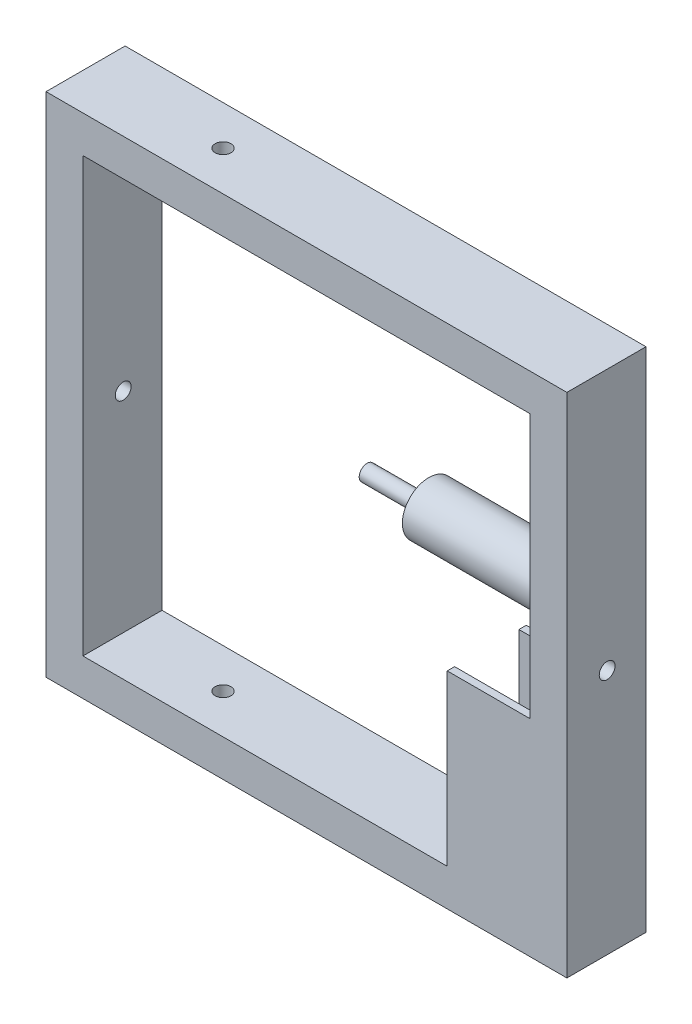
ISO-10303-21;
HEADER;
FILE_DESCRIPTION(('STEP AP214'),'2;1');
FILE_NAME('part.step','',(''),(''),'','','');
FILE_SCHEMA(('AUTOMOTIVE_DESIGN { 1 0 10303 214 1 1 1 1 }'));
ENDSEC;
DATA;
#1=APPLICATION_CONTEXT('core data for automotive mechanical design processes');
#2=APPLICATION_PROTOCOL_DEFINITION('international standard','automotive_design',2000,#1);
#3=PRODUCT_CONTEXT('',#1,'mechanical');
#4=PRODUCT('Part','Part','',(#3));
#5=PRODUCT_RELATED_PRODUCT_CATEGORY('part','',(#4));
#6=PRODUCT_DEFINITION_FORMATION('','',#4);
#7=PRODUCT_DEFINITION_CONTEXT('part definition',#1,'design');
#8=PRODUCT_DEFINITION('design','',#6,#7);
#9=PRODUCT_DEFINITION_SHAPE('','',#8);
#10=(LENGTH_UNIT() NAMED_UNIT(*) SI_UNIT(.MILLI.,.METRE.));
#11=(NAMED_UNIT(*) PLANE_ANGLE_UNIT() SI_UNIT($,.RADIAN.));
#12=(NAMED_UNIT(*) SI_UNIT($,.STERADIAN.) SOLID_ANGLE_UNIT());
#13=UNCERTAINTY_MEASURE_WITH_UNIT(LENGTH_MEASURE(1.E-05),#10,'distance_accuracy_value','');
#14=(GEOMETRIC_REPRESENTATION_CONTEXT(3) GLOBAL_UNCERTAINTY_ASSIGNED_CONTEXT((#13)) GLOBAL_UNIT_ASSIGNED_CONTEXT((#10,
#11,#12)) REPRESENTATION_CONTEXT('',''));
#15=CARTESIAN_POINT('',(0.,0.,0.));
#16=DIRECTION('',(0.,0.,1.));
#17=DIRECTION('',(1.,0.,0.));
#18=AXIS2_PLACEMENT_3D('',#15,#16,#17);
#19=CARTESIAN_POINT('',(76.1000000000001,-85.2151870138584,0.));
#20=DIRECTION('',(0.,-1.,0.));
#21=DIRECTION('',(1.,0.,0.));
#22=AXIS2_PLACEMENT_3D('',#19,#20,#21);
#23=PLANE('',#22);
#24=DIRECTION('',(1.,0.,0.));
#25=VECTOR('',#24,1.);
#26=CARTESIAN_POINT('',(76.1000000000001,-85.2151870138584,13.6));
#27=LINE('',#26,#25);
#28=CARTESIAN_POINT('',(76.1000000000001,-85.2151870138584,13.6));
#29=VERTEX_POINT('',#28);
#30=CARTESIAN_POINT('',(82.8000000000001,-85.2151870138584,13.6));
#31=VERTEX_POINT('',#30);
#32=EDGE_CURVE('E52',#29,#31,#27,.T.);
#33=ORIENTED_EDGE('',*,*,#32,.T.);
#34=DIRECTION('',(0.,0.,-1.));
#35=VECTOR('',#34,1.);
#36=CARTESIAN_POINT('',(82.8000000000001,-85.2151870138584,0.));
#37=LINE('',#36,#35);
#38=CARTESIAN_POINT('',(82.8000000000001,-85.2151870138584,1.4));
#39=VERTEX_POINT('',#38);
#40=EDGE_CURVE('E191',#31,#39,#37,.T.);
#41=ORIENTED_EDGE('',*,*,#40,.T.);
#42=DIRECTION('',(1.,0.,0.));
#43=VECTOR('',#42,1.);
#44=CARTESIAN_POINT('',(76.1000000000001,-85.2151870138584,1.4));
#45=LINE('',#44,#43);
#46=CARTESIAN_POINT('',(76.1000000000001,-85.2151870138584,1.4));
#47=VERTEX_POINT('',#46);
#48=EDGE_CURVE('E189',#47,#39,#45,.T.);
#49=ORIENTED_EDGE('',*,*,#48,.F.);
#50=DIRECTION('',(0.,0.,-1.));
#51=VECTOR('',#50,1.);
#52=CARTESIAN_POINT('',(76.1000000000001,-85.2151870138584,0.));
#53=LINE('',#52,#51);
#54=EDGE_CURVE('E172',#29,#47,#53,.T.);
#55=ORIENTED_EDGE('',*,*,#54,.F.);
#56=EDGE_LOOP('',(#33,#41,#49,#55));
#57=FACE_BOUND('',#56,.T.);
#58=ADVANCED_FACE('F35',(#57),#23,.F.);
#59=CARTESIAN_POINT('',(82.8,-57.1,0.));
#60=DIRECTION('',(0.,1.,0.));
#61=DIRECTION('',(-1.,0.,0.));
#62=AXIS2_PLACEMENT_3D('',#59,#60,#61);
#63=PLANE('',#62);
#64=DIRECTION('',(-1.,0.,0.));
#65=VECTOR('',#64,1.);
#66=CARTESIAN_POINT('',(82.8,-57.1,1.4));
#67=LINE('',#66,#65);
#68=CARTESIAN_POINT('',(91.8,-57.1,1.4));
#69=VERTEX_POINT('',#68);
#70=CARTESIAN_POINT('',(76.1,-57.1,1.4));
#71=VERTEX_POINT('',#70);
#72=EDGE_CURVE('E226',#69,#71,#67,.T.);
#73=ORIENTED_EDGE('',*,*,#72,.F.);
#74=DIRECTION('',(0.,0.,-1.));
#75=VECTOR('',#74,1.);
#76=CARTESIAN_POINT('',(91.8,-57.1,58.));
#77=LINE('',#76,#75);
#78=CARTESIAN_POINT('',(91.8,-57.1,0.));
#79=VERTEX_POINT('',#78);
#80=EDGE_CURVE('E285',#69,#79,#77,.T.);
#81=ORIENTED_EDGE('',*,*,#80,.T.);
#82=DIRECTION('',(1.,0.,0.));
#83=VECTOR('',#82,1.);
#84=CARTESIAN_POINT('',(82.8,-57.1,0.));
#85=LINE('',#84,#83);
#86=CARTESIAN_POINT('',(76.1,-57.1,0.));
#87=VERTEX_POINT('',#86);
#88=EDGE_CURVE('E164',#87,#79,#85,.T.);
#89=ORIENTED_EDGE('',*,*,#88,.F.);
#90=DIRECTION('',(0.,0.,-1.));
#91=VECTOR('',#90,1.);
#92=CARTESIAN_POINT('',(76.1,-57.1,0.));
#93=LINE('',#92,#91);
#94=EDGE_CURVE('E186',#71,#87,#93,.T.);
#95=ORIENTED_EDGE('',*,*,#94,.F.);
#96=EDGE_LOOP('',(#73,#81,#89,#95));
#97=FACE_BOUND('',#96,.T.);
#98=ADVANCED_FACE('F349',(#97),#63,.T.);
#99=CARTESIAN_POINT('',(0.,0.,15.));
#100=DIRECTION('',(0.,0.,1.));
#101=DIRECTION('',(1.,0.,0.));
#102=AXIS2_PLACEMENT_3D('',#99,#100,#101);
#103=PLANE('',#102);
#104=DIRECTION('',(0.,1.,0.));
#105=VECTOR('',#104,1.);
#106=CARTESIAN_POINT('',(76.1000000000001,-85.2151870138584,15.));
#107=LINE('',#106,#105);
#108=CARTESIAN_POINT('',(76.1000000000001,-89.2,15.));
#109=VERTEX_POINT('',#108);
#110=CARTESIAN_POINT('',(76.1,-57.1,15.));
#111=VERTEX_POINT('',#110);
#112=EDGE_CURVE('E155',#109,#111,#107,.T.);
#113=ORIENTED_EDGE('',*,*,#112,.F.);
#114=DIRECTION('',(-1.,0.,0.));
#115=VECTOR('',#114,1.);
#116=CARTESIAN_POINT('',(0.,-89.2,15.));
#117=LINE('',#116,#115);
#118=CARTESIAN_POINT('',(7.,-89.2,15.));
#119=VERTEX_POINT('',#118);
#120=EDGE_CURVE('E240',#109,#119,#117,.T.);
#121=ORIENTED_EDGE('',*,*,#120,.T.);
#122=DIRECTION('',(0.,1.,0.));
#123=VECTOR('',#122,1.);
#124=CARTESIAN_POINT('',(7.,0.,15.));
#125=LINE('',#124,#123);
#126=CARTESIAN_POINT('',(7.,-7.,15.));
#127=VERTEX_POINT('',#126);
#128=EDGE_CURVE('E242',#119,#127,#125,.T.);
#129=ORIENTED_EDGE('',*,*,#128,.T.);
#130=DIRECTION('',(1.,0.,0.));
#131=VECTOR('',#130,1.);
#132=CARTESIAN_POINT('',(0.,-7.,15.));
#133=LINE('',#132,#131);
#134=CARTESIAN_POINT('',(91.8,-7.,15.));
#135=VERTEX_POINT('',#134);
#136=EDGE_CURVE('E237',#127,#135,#133,.T.);
#137=ORIENTED_EDGE('',*,*,#136,.T.);
#138=DIRECTION('',(0.,-1.,0.));
#139=VECTOR('',#138,1.);
#140=CARTESIAN_POINT('',(91.8,0.,15.));
#141=LINE('',#140,#139);
#142=CARTESIAN_POINT('',(91.8,-57.1,15.));
#143=VERTEX_POINT('',#142);
#144=EDGE_CURVE('E159',#135,#143,#141,.T.);
#145=ORIENTED_EDGE('',*,*,#144,.T.);
#146=DIRECTION('',(1.,0.,0.));
#147=VECTOR('',#146,1.);
#148=CARTESIAN_POINT('',(82.8,-57.1,15.));
#149=LINE('',#148,#147);
#150=EDGE_CURVE('E151',#111,#143,#149,.T.);
#151=ORIENTED_EDGE('',*,*,#150,.F.);
#152=EDGE_LOOP('',(#113,#121,#129,#137,#145,#151));
#153=FACE_BOUND('',#152,.T.);
#154=DIRECTION('',(0.,1.,0.));
#155=VECTOR('',#154,1.);
#156=CARTESIAN_POINT('',(98.8,0.,15.));
#157=LINE('',#156,#155);
#158=CARTESIAN_POINT('',(98.8,-96.2,15.));
#159=VERTEX_POINT('',#158);
#160=CARTESIAN_POINT('',(98.8,0.,15.));
#161=VERTEX_POINT('',#160);
#162=EDGE_CURVE('E252',#159,#161,#157,.T.);
#163=ORIENTED_EDGE('',*,*,#162,.T.);
#164=DIRECTION('',(-1.,0.,0.));
#165=VECTOR('',#164,1.);
#166=CARTESIAN_POINT('',(0.,0.,15.));
#167=LINE('',#166,#165);
#168=CARTESIAN_POINT('',(0.,0.,15.));
#169=VERTEX_POINT('',#168);
#170=EDGE_CURVE('E254',#161,#169,#167,.T.);
#171=ORIENTED_EDGE('',*,*,#170,.T.);
#172=DIRECTION('',(0.,-1.,0.));
#173=VECTOR('',#172,1.);
#174=CARTESIAN_POINT('',(0.,0.,15.));
#175=LINE('',#174,#173);
#176=CARTESIAN_POINT('',(0.,-96.2,15.));
#177=VERTEX_POINT('',#176);
#178=EDGE_CURVE('E246',#169,#177,#175,.T.);
#179=ORIENTED_EDGE('',*,*,#178,.T.);
#180=DIRECTION('',(1.,0.,0.));
#181=VECTOR('',#180,1.);
#182=CARTESIAN_POINT('',(0.,-96.2,15.));
#183=LINE('',#182,#181);
#184=EDGE_CURVE('E249',#177,#159,#183,.T.);
#185=ORIENTED_EDGE('',*,*,#184,.T.);
#186=EDGE_LOOP('',(#163,#171,#179,#185));
#187=FACE_BOUND('',#186,.T.);
#188=ADVANCED_FACE('F153',(#153,#187),#103,.T.);
#189=CARTESIAN_POINT('',(0.,0.,0.));
#190=DIRECTION('',(0.,0.,1.));
#191=DIRECTION('',(1.,0.,0.));
#192=AXIS2_PLACEMENT_3D('',#189,#190,#191);
#193=PLANE('',#192);
#194=DIRECTION('',(0.,-1.,0.));
#195=VECTOR('',#194,1.);
#196=CARTESIAN_POINT('',(76.1000000000001,-85.2151870138584,0.));
#197=LINE('',#196,#195);
#198=CARTESIAN_POINT('',(76.1000000000001,-89.2,0.));
#199=VERTEX_POINT('',#198);
#200=EDGE_CURVE('E192',#87,#199,#197,.T.);
#201=ORIENTED_EDGE('',*,*,#200,.F.);
#202=ORIENTED_EDGE('',*,*,#88,.T.);
#203=DIRECTION('',(0.,-1.,0.));
#204=VECTOR('',#203,1.);
#205=CARTESIAN_POINT('',(91.8,0.,0.));
#206=LINE('',#205,#204);
#207=CARTESIAN_POINT('',(91.8,-7.,0.));
#208=VERTEX_POINT('',#207);
#209=EDGE_CURVE('E277',#208,#79,#206,.T.);
#210=ORIENTED_EDGE('',*,*,#209,.F.);
#211=DIRECTION('',(1.,0.,0.));
#212=VECTOR('',#211,1.);
#213=CARTESIAN_POINT('',(0.,-7.,0.));
#214=LINE('',#213,#212);
#215=CARTESIAN_POINT('',(7.,-7.,0.));
#216=VERTEX_POINT('',#215);
#217=EDGE_CURVE('E275',#216,#208,#214,.T.);
#218=ORIENTED_EDGE('',*,*,#217,.F.);
#219=DIRECTION('',(0.,1.,0.));
#220=VECTOR('',#219,1.);
#221=CARTESIAN_POINT('',(7.,0.,0.));
#222=LINE('',#221,#220);
#223=CARTESIAN_POINT('',(7.,-89.2,0.));
#224=VERTEX_POINT('',#223);
#225=EDGE_CURVE('E282',#224,#216,#222,.T.);
#226=ORIENTED_EDGE('',*,*,#225,.F.);
#227=DIRECTION('',(-1.,0.,0.));
#228=VECTOR('',#227,1.);
#229=CARTESIAN_POINT('',(0.,-89.2,0.));
#230=LINE('',#229,#228);
#231=EDGE_CURVE('E280',#199,#224,#230,.T.);
#232=ORIENTED_EDGE('',*,*,#231,.F.);
#233=EDGE_LOOP('',(#201,#202,#210,#218,#226,#232));
#234=FACE_BOUND('',#233,.T.);
#235=DIRECTION('',(-1.,0.,0.));
#236=VECTOR('',#235,1.);
#237=CARTESIAN_POINT('',(0.,0.,0.));
#238=LINE('',#237,#236);
#239=CARTESIAN_POINT('',(98.8,0.,0.));
#240=VERTEX_POINT('',#239);
#241=CARTESIAN_POINT('',(0.,0.,0.));
#242=VERTEX_POINT('',#241);
#243=EDGE_CURVE('E250',#240,#242,#238,.T.);
#244=ORIENTED_EDGE('',*,*,#243,.F.);
#245=DIRECTION('',(0.,1.,0.));
#246=VECTOR('',#245,1.);
#247=CARTESIAN_POINT('',(98.8,0.,0.));
#248=LINE('',#247,#246);
#249=CARTESIAN_POINT('',(98.8,-96.2,0.));
#250=VERTEX_POINT('',#249);
#251=EDGE_CURVE('E261',#250,#240,#248,.T.);
#252=ORIENTED_EDGE('',*,*,#251,.F.);
#253=DIRECTION('',(1.,0.,0.));
#254=VECTOR('',#253,1.);
#255=CARTESIAN_POINT('',(0.,-96.2,0.));
#256=LINE('',#255,#254);
#257=CARTESIAN_POINT('',(0.,-96.2,0.));
#258=VERTEX_POINT('',#257);
#259=EDGE_CURVE('E259',#258,#250,#256,.T.);
#260=ORIENTED_EDGE('',*,*,#259,.F.);
#261=DIRECTION('',(0.,-1.,0.));
#262=VECTOR('',#261,1.);
#263=CARTESIAN_POINT('',(0.,0.,0.));
#264=LINE('',#263,#262);
#265=EDGE_CURVE('E245',#242,#258,#264,.T.);
#266=ORIENTED_EDGE('',*,*,#265,.F.);
#267=EDGE_LOOP('',(#244,#252,#260,#266));
#268=FACE_BOUND('',#267,.T.);
#269=ADVANCED_FACE('F318',(#234,#268),#193,.F.);
#270=CARTESIAN_POINT('',(0.,0.,15.));
#271=DIRECTION('',(1.,0.,0.));
#272=DIRECTION('',(0.,1.,0.));
#273=AXIS2_PLACEMENT_3D('',#270,#271,#272);
#274=PLANE('',#273);
#275=CARTESIAN_POINT('',(0.,-49.5018127111706,7.36560305807643));
#276=DIRECTION('',(1.,0.,0.));
#277=DIRECTION('',(0.,1.,0.));
#278=AXIS2_PLACEMENT_3D('',#275,#276,#277);
#279=CIRCLE('',#278,1.5);
#280=CARTESIAN_POINT('',(0.,-48.0018127111706,7.36560305807643));
#281=VERTEX_POINT('',#280);
#282=EDGE_CURVE('E180',#281,#281,#279,.F.);
#283=ORIENTED_EDGE('',*,*,#282,.F.);
#284=EDGE_LOOP('',(#283));
#285=FACE_BOUND('',#284,.T.);
#286=ORIENTED_EDGE('',*,*,#265,.T.);
#287=DIRECTION('',(0.,0.,-1.));
#288=VECTOR('',#287,1.);
#289=CARTESIAN_POINT('',(0.,-96.2,15.));
#290=LINE('',#289,#288);
#291=EDGE_CURVE('E272',#177,#258,#290,.T.);
#292=ORIENTED_EDGE('',*,*,#291,.F.);
#293=ORIENTED_EDGE('',*,*,#178,.F.);
#294=DIRECTION('',(0.,0.,-1.));
#295=VECTOR('',#294,1.);
#296=CARTESIAN_POINT('',(0.,0.,15.));
#297=LINE('',#296,#295);
#298=EDGE_CURVE('E256',#169,#242,#297,.T.);
#299=ORIENTED_EDGE('',*,*,#298,.T.);
#300=EDGE_LOOP('',(#286,#292,#293,#299));
#301=FACE_BOUND('',#300,.T.);
#302=ADVANCED_FACE('F314',(#285,#301),#274,.F.);
#303=CARTESIAN_POINT('',(0.,-96.2,15.));
#304=DIRECTION('',(0.,1.,0.));
#305=DIRECTION('',(0.,0.,1.));
#306=AXIS2_PLACEMENT_3D('',#303,#304,#305);
#307=PLANE('',#306);
#308=CARTESIAN_POINT('',(26.080914383698,-96.2,7.5));
#309=DIRECTION('',(0.,1.,0.));
#310=DIRECTION('',(0.,0.,1.));
#311=AXIS2_PLACEMENT_3D('',#308,#309,#310);
#312=CIRCLE('',#311,1.5);
#313=CARTESIAN_POINT('',(26.080914383698,-96.2,9.));
#314=VERTEX_POINT('',#313);
#315=EDGE_CURVE('E292',#314,#314,#312,.F.);
#316=ORIENTED_EDGE('',*,*,#315,.F.);
#317=EDGE_LOOP('',(#316));
#318=FACE_BOUND('',#317,.T.);
#319=ORIENTED_EDGE('',*,*,#259,.T.);
#320=DIRECTION('',(0.,0.,-1.));
#321=VECTOR('',#320,1.);
#322=CARTESIAN_POINT('',(98.8,-96.2,15.));
#323=LINE('',#322,#321);
#324=EDGE_CURVE('E269',#159,#250,#323,.T.);
#325=ORIENTED_EDGE('',*,*,#324,.F.);
#326=ORIENTED_EDGE('',*,*,#184,.F.);
#327=ORIENTED_EDGE('',*,*,#291,.T.);
#328=EDGE_LOOP('',(#319,#325,#326,#327));
#329=FACE_BOUND('',#328,.T.);
#330=ADVANCED_FACE('F317',(#318,#329),#307,.F.);
#331=CARTESIAN_POINT('',(98.8,0.,15.));
#332=DIRECTION('',(-1.,0.,0.));
#333=DIRECTION('',(0.,-1.,0.));
#334=AXIS2_PLACEMENT_3D('',#331,#332,#333);
#335=PLANE('',#334);
#336=CARTESIAN_POINT('',(98.8,-49.5018127111706,7.36560305807643));
#337=DIRECTION('',(-1.,0.,0.));
#338=DIRECTION('',(0.,-1.,0.));
#339=AXIS2_PLACEMENT_3D('',#336,#337,#338);
#340=CIRCLE('',#339,1.5);
#341=CARTESIAN_POINT('',(98.8,-51.0018127111706,7.36560305807643));
#342=VERTEX_POINT('',#341);
#343=EDGE_CURVE('E296',#342,#342,#340,.F.);
#344=ORIENTED_EDGE('',*,*,#343,.F.);
#345=EDGE_LOOP('',(#344));
#346=FACE_BOUND('',#345,.T.);
#347=DIRECTION('',(0.,0.,-1.));
#348=VECTOR('',#347,1.);
#349=CARTESIAN_POINT('',(98.8,0.,15.));
#350=LINE('',#349,#348);
#351=EDGE_CURVE('E266',#161,#240,#350,.T.);
#352=ORIENTED_EDGE('',*,*,#351,.F.);
#353=ORIENTED_EDGE('',*,*,#162,.F.);
#354=ORIENTED_EDGE('',*,*,#324,.T.);
#355=ORIENTED_EDGE('',*,*,#251,.T.);
#356=EDGE_LOOP('',(#352,#353,#354,#355));
#357=FACE_BOUND('',#356,.T.);
#358=ADVANCED_FACE('F334',(#346,#357),#335,.F.);
#359=CARTESIAN_POINT('',(0.,0.,15.));
#360=DIRECTION('',(0.,-1.,0.));
#361=DIRECTION('',(0.,0.,-1.));
#362=AXIS2_PLACEMENT_3D('',#359,#360,#361);
#363=PLANE('',#362);
#364=CARTESIAN_POINT('',(26.080914383698,0.,7.5));
#365=DIRECTION('',(0.,-1.,0.));
#366=DIRECTION('',(0.,0.,-1.));
#367=AXIS2_PLACEMENT_3D('',#364,#365,#366);
#368=CIRCLE('',#367,1.5);
#369=CARTESIAN_POINT('',(26.080914383698,0.,6.));
#370=VERTEX_POINT('',#369);
#371=EDGE_CURVE('E299',#370,#370,#368,.F.);
#372=ORIENTED_EDGE('',*,*,#371,.F.);
#373=EDGE_LOOP('',(#372));
#374=FACE_BOUND('',#373,.T.);
#375=ORIENTED_EDGE('',*,*,#243,.T.);
#376=ORIENTED_EDGE('',*,*,#298,.F.);
#377=ORIENTED_EDGE('',*,*,#170,.F.);
#378=ORIENTED_EDGE('',*,*,#351,.T.);
#379=EDGE_LOOP('',(#375,#376,#377,#378));
#380=FACE_BOUND('',#379,.T.);
#381=ADVANCED_FACE('F332',(#374,#380),#363,.F.);
#382=CARTESIAN_POINT('',(7.,-7.,58.));
#383=DIRECTION('',(1.,0.,0.));
#384=DIRECTION('',(0.,0.,-1.));
#385=AXIS2_PLACEMENT_3D('',#382,#383,#384);
#386=PLANE('',#385);
#387=CARTESIAN_POINT('',(7.00000000000001,-49.5018127111706,7.36560305807643));
#388=DIRECTION('',(1.,0.,0.));
#389=DIRECTION('',(0.,0.,-1.));
#390=AXIS2_PLACEMENT_3D('',#387,#388,#389);
#391=CIRCLE('',#390,1.5);
#392=CARTESIAN_POINT('',(7.00000000000001,-49.5018127111706,5.86560305807643));
#393=VERTEX_POINT('',#392);
#394=EDGE_CURVE('E291',#393,#393,#391,.F.);
#395=ORIENTED_EDGE('',*,*,#394,.T.);
#396=EDGE_LOOP('',(#395));
#397=FACE_BOUND('',#396,.T.);
#398=DIRECTION('',(0.,0.,-1.));
#399=VECTOR('',#398,1.);
#400=CARTESIAN_POINT('',(7.,-89.2,58.));
#401=LINE('',#400,#399);
#402=EDGE_CURVE('E234',#119,#224,#401,.T.);
#403=ORIENTED_EDGE('',*,*,#402,.T.);
#404=ORIENTED_EDGE('',*,*,#225,.T.);
#405=DIRECTION('',(0.,0.,-1.));
#406=VECTOR('',#405,1.);
#407=CARTESIAN_POINT('',(7.,-7.,58.));
#408=LINE('',#407,#406);
#409=EDGE_CURVE('E163',#127,#216,#408,.T.);
#410=ORIENTED_EDGE('',*,*,#409,.F.);
#411=ORIENTED_EDGE('',*,*,#128,.F.);
#412=EDGE_LOOP('',(#403,#404,#410,#411));
#413=FACE_BOUND('',#412,.T.);
#414=ADVANCED_FACE('F342',(#397,#413),#386,.T.);
#415=CARTESIAN_POINT('',(7.,-89.2,58.));
#416=DIRECTION('',(0.,1.,0.));
#417=DIRECTION('',(-1.,0.,0.));
#418=AXIS2_PLACEMENT_3D('',#415,#416,#417);
#419=PLANE('',#418);
#420=CARTESIAN_POINT('',(26.080914383698,-89.2,7.5));
#421=DIRECTION('',(0.,1.,0.));
#422=DIRECTION('',(-1.,0.,0.));
#423=AXIS2_PLACEMENT_3D('',#420,#421,#422);
#424=CIRCLE('',#423,1.5);
#425=CARTESIAN_POINT('',(24.580914383698,-89.2,7.5));
#426=VERTEX_POINT('',#425);
#427=EDGE_CURVE('E304',#426,#426,#424,.F.);
#428=ORIENTED_EDGE('',*,*,#427,.T.);
#429=EDGE_LOOP('',(#428));
#430=FACE_BOUND('',#429,.T.);
#431=DIRECTION('',(0.,0.,1.));
#432=VECTOR('',#431,1.);
#433=CARTESIAN_POINT('',(76.1000000000001,-89.2,0.));
#434=LINE('',#433,#432);
#435=EDGE_CURVE('E171',#199,#109,#434,.T.);
#436=ORIENTED_EDGE('',*,*,#435,.F.);
#437=ORIENTED_EDGE('',*,*,#231,.T.);
#438=ORIENTED_EDGE('',*,*,#402,.F.);
#439=ORIENTED_EDGE('',*,*,#120,.F.);
#440=EDGE_LOOP('',(#436,#437,#438,#439));
#441=FACE_BOUND('',#440,.T.);
#442=ADVANCED_FACE('F394',(#430,#441),#419,.T.);
#443=CARTESIAN_POINT('',(91.8,-7.,58.));
#444=DIRECTION('',(-1.,0.,0.));
#445=DIRECTION('',(0.,0.,1.));
#446=AXIS2_PLACEMENT_3D('',#443,#444,#445);
#447=PLANE('',#446);
#448=CARTESIAN_POINT('',(91.8,-49.5018127111706,7.36560305807643));
#449=DIRECTION('',(-1.,0.,0.));
#450=DIRECTION('',(0.,0.,1.));
#451=AXIS2_PLACEMENT_3D('',#448,#449,#450);
#452=CIRCLE('',#451,1.5);
#453=CARTESIAN_POINT('',(91.8,-49.5018127111706,8.86560305807643));
#454=VERTEX_POINT('',#453);
#455=EDGE_CURVE('E289',#454,#454,#452,.F.);
#456=ORIENTED_EDGE('',*,*,#455,.T.);
#457=EDGE_LOOP('',(#456));
#458=FACE_BOUND('',#457,.T.);
#459=CARTESIAN_POINT('',(91.8,-39.6,7.49999999999999));
#460=DIRECTION('',(-1.,0.,0.));
#461=DIRECTION('',(0.,0.,1.));
#462=AXIS2_PLACEMENT_3D('',#459,#460,#461);
#463=CIRCLE('',#462,5.01151916714093);
#464=CARTESIAN_POINT('',(91.8,-39.6,12.5115191671409));
#465=VERTEX_POINT('',#464);
#466=EDGE_CURVE('E201',#465,#465,#463,.T.);
#467=ORIENTED_EDGE('',*,*,#466,.F.);
#468=EDGE_LOOP('',(#467));
#469=FACE_BOUND('',#468,.T.);
#470=ORIENTED_EDGE('',*,*,#80,.F.);
#471=DIRECTION('',(0.,-1.,0.));
#472=VECTOR('',#471,1.);
#473=CARTESIAN_POINT('',(91.8,-57.,1.4));
#474=LINE('',#473,#472);
#475=CARTESIAN_POINT('',(91.8,-85.2,1.4));
#476=VERTEX_POINT('',#475);
#477=EDGE_CURVE('E210',#69,#476,#474,.T.);
#478=ORIENTED_EDGE('',*,*,#477,.T.);
#479=DIRECTION('',(0.,0.,1.));
#480=VECTOR('',#479,1.);
#481=CARTESIAN_POINT('',(91.8,-85.2,1.4));
#482=LINE('',#481,#480);
#483=CARTESIAN_POINT('',(91.8,-85.2,13.6));
#484=VERTEX_POINT('',#483);
#485=EDGE_CURVE('E214',#476,#484,#482,.T.);
#486=ORIENTED_EDGE('',*,*,#485,.T.);
#487=DIRECTION('',(0.,1.,0.));
#488=VECTOR('',#487,1.);
#489=CARTESIAN_POINT('',(91.8,-57.,13.6));
#490=LINE('',#489,#488);
#491=CARTESIAN_POINT('',(91.8,-57.1,13.6));
#492=VERTEX_POINT('',#491);
#493=EDGE_CURVE('E217',#484,#492,#490,.T.);
#494=ORIENTED_EDGE('',*,*,#493,.T.);
#495=EDGE_CURVE('E206',#143,#492,#77,.T.);
#496=ORIENTED_EDGE('',*,*,#495,.F.);
#497=ORIENTED_EDGE('',*,*,#144,.F.);
#498=DIRECTION('',(0.,0.,-1.));
#499=VECTOR('',#498,1.);
#500=CARTESIAN_POINT('',(91.8,-7.,58.));
#501=LINE('',#500,#499);
#502=EDGE_CURVE('E231',#135,#208,#501,.T.);
#503=ORIENTED_EDGE('',*,*,#502,.T.);
#504=ORIENTED_EDGE('',*,*,#209,.T.);
#505=EDGE_LOOP('',(#470,#478,#486,#494,#496,#497,#503,#504));
#506=FACE_BOUND('',#505,.T.);
#507=ADVANCED_FACE('F390',(#458,#469,#506),#447,.T.);
#508=CARTESIAN_POINT('',(7.,-7.,58.));
#509=DIRECTION('',(0.,-1.,0.));
#510=DIRECTION('',(1.,0.,0.));
#511=AXIS2_PLACEMENT_3D('',#508,#509,#510);
#512=PLANE('',#511);
#513=CARTESIAN_POINT('',(26.080914383698,-7.,7.5));
#514=DIRECTION('',(0.,-1.,0.));
#515=DIRECTION('',(1.,0.,0.));
#516=AXIS2_PLACEMENT_3D('',#513,#514,#515);
#517=CIRCLE('',#516,1.5);
#518=CARTESIAN_POINT('',(27.580914383698,-7.,7.5));
#519=VERTEX_POINT('',#518);
#520=EDGE_CURVE('E39',#519,#519,#517,.F.);
#521=ORIENTED_EDGE('',*,*,#520,.T.);
#522=EDGE_LOOP('',(#521));
#523=FACE_BOUND('',#522,.T.);
#524=ORIENTED_EDGE('',*,*,#409,.T.);
#525=ORIENTED_EDGE('',*,*,#217,.T.);
#526=ORIENTED_EDGE('',*,*,#502,.F.);
#527=ORIENTED_EDGE('',*,*,#136,.F.);
#528=EDGE_LOOP('',(#524,#525,#526,#527));
#529=FACE_BOUND('',#528,.T.);
#530=ADVANCED_FACE('F387',(#523,#529),#512,.T.);
#531=DIRECTION('',(1.,0.,0.));
#532=VECTOR('',#531,1.);
#533=CARTESIAN_POINT('',(82.8,-57.1,13.6));
#534=LINE('',#533,#532);
#535=CARTESIAN_POINT('',(76.1,-57.1,13.6));
#536=VERTEX_POINT('',#535);
#537=EDGE_CURVE('E175',#536,#492,#534,.T.);
#538=ORIENTED_EDGE('',*,*,#537,.F.);
#539=DIRECTION('',(0.,0.,-1.));
#540=VECTOR('',#539,1.);
#541=CARTESIAN_POINT('',(76.1,-57.1,13.6));
#542=LINE('',#541,#540);
#543=EDGE_CURVE('E169',#111,#536,#542,.T.);
#544=ORIENTED_EDGE('',*,*,#543,.F.);
#545=ORIENTED_EDGE('',*,*,#150,.T.);
#546=ORIENTED_EDGE('',*,*,#495,.T.);
#547=EDGE_LOOP('',(#538,#544,#545,#546));
#548=FACE_BOUND('',#547,.T.);
#549=ADVANCED_FACE('F174',(#548),#63,.T.);
#550=CARTESIAN_POINT('',(91.8,-57.,1.4));
#551=DIRECTION('',(0.,0.,-1.));
#552=DIRECTION('',(0.,1.,0.));
#553=AXIS2_PLACEMENT_3D('',#550,#551,#552);
#554=PLANE('',#553);
#555=ORIENTED_EDGE('',*,*,#72,.T.);
#556=DIRECTION('',(0.,1.,0.));
#557=VECTOR('',#556,1.);
#558=CARTESIAN_POINT('',(76.1,-57.1,1.4));
#559=LINE('',#558,#557);
#560=EDGE_CURVE('E178',#47,#71,#559,.T.);
#561=ORIENTED_EDGE('',*,*,#560,.F.);
#562=ORIENTED_EDGE('',*,*,#48,.T.);
#563=CARTESIAN_POINT('',(83.350917082489,-95.2,1.4));
#564=DIRECTION('',(0.,0.,-1.));
#565=DIRECTION('',(0.,1.,0.));
#566=AXIS2_PLACEMENT_3D('',#563,#564,#565);
#567=CIRCLE('',#566,10.);
#568=CARTESIAN_POINT('',(83.350917082489,-85.2,1.4));
#569=VERTEX_POINT('',#568);
#570=EDGE_CURVE('E11',#39,#569,#567,.T.);
#571=ORIENTED_EDGE('',*,*,#570,.T.);
#572=DIRECTION('',(-1.,0.,0.));
#573=VECTOR('',#572,1.);
#574=CARTESIAN_POINT('',(91.8,-85.2,1.4));
#575=LINE('',#574,#573);
#576=EDGE_CURVE('E220',#476,#569,#575,.T.);
#577=ORIENTED_EDGE('',*,*,#576,.F.);
#578=ORIENTED_EDGE('',*,*,#477,.F.);
#579=EDGE_LOOP('',(#555,#561,#562,#571,#577,#578));
#580=FACE_BOUND('',#579,.T.);
#581=ADVANCED_FACE('F380',(#580),#554,.F.);
#582=CARTESIAN_POINT('',(91.8,-57.,13.6));
#583=DIRECTION('',(0.,0.,1.));
#584=DIRECTION('',(0.,-1.,0.));
#585=AXIS2_PLACEMENT_3D('',#582,#583,#584);
#586=PLANE('',#585);
#587=ORIENTED_EDGE('',*,*,#537,.T.);
#588=ORIENTED_EDGE('',*,*,#493,.F.);
#589=DIRECTION('',(-1.,0.,0.));
#590=VECTOR('',#589,1.);
#591=CARTESIAN_POINT('',(91.8,-85.2,13.6));
#592=LINE('',#591,#590);
#593=CARTESIAN_POINT('',(83.350917082489,-85.2,13.6));
#594=VERTEX_POINT('',#593);
#595=EDGE_CURVE('E221',#484,#594,#592,.T.);
#596=ORIENTED_EDGE('',*,*,#595,.T.);
#597=CARTESIAN_POINT('',(83.350917082489,-95.2,13.6));
#598=DIRECTION('',(0.,0.,1.));
#599=DIRECTION('',(0.,-1.,0.));
#600=AXIS2_PLACEMENT_3D('',#597,#598,#599);
#601=CIRCLE('',#600,10.);
#602=EDGE_CURVE('E44',#594,#31,#601,.T.);
#603=ORIENTED_EDGE('',*,*,#602,.T.);
#604=ORIENTED_EDGE('',*,*,#32,.F.);
#605=DIRECTION('',(0.,-1.,0.));
#606=VECTOR('',#605,1.);
#607=CARTESIAN_POINT('',(76.1,-57.1,13.6));
#608=LINE('',#607,#606);
#609=EDGE_CURVE('E176',#536,#29,#608,.T.);
#610=ORIENTED_EDGE('',*,*,#609,.F.);
#611=EDGE_LOOP('',(#587,#588,#596,#603,#604,#610));
#612=FACE_BOUND('',#611,.T.);
#613=ADVANCED_FACE('F377',(#612),#586,.F.);
#614=CARTESIAN_POINT('',(91.8,-85.2,1.4));
#615=DIRECTION('',(0.,-1.,0.));
#616=DIRECTION('',(1.,0.,0.));
#617=AXIS2_PLACEMENT_3D('',#614,#615,#616);
#618=PLANE('',#617);
#619=ORIENTED_EDGE('',*,*,#576,.T.);
#620=DIRECTION('',(0.,0.,1.));
#621=VECTOR('',#620,1.);
#622=CARTESIAN_POINT('',(83.350917082489,-85.2,1.4));
#623=LINE('',#622,#621);
#624=EDGE_CURVE('E205',#569,#594,#623,.T.);
#625=ORIENTED_EDGE('',*,*,#624,.T.);
#626=ORIENTED_EDGE('',*,*,#595,.F.);
#627=ORIENTED_EDGE('',*,*,#485,.F.);
#628=EDGE_LOOP('',(#619,#625,#626,#627));
#629=FACE_BOUND('',#628,.T.);
#630=ADVANCED_FACE('F375',(#629),#618,.F.);
#631=CARTESIAN_POINT('',(65.1,-39.6,7.49999999999999));
#632=DIRECTION('',(1.,0.,0.));
#633=DIRECTION('',(0.,0.,-1.));
#634=AXIS2_PLACEMENT_3D('',#631,#632,#633);
#635=CYLINDRICAL_SURFACE('',#634,5.01151916714093);
#636=CARTESIAN_POINT('',(65.1,-39.6,7.49999999999999));
#637=DIRECTION('',(-1.,0.,0.));
#638=DIRECTION('',(0.,0.,1.));
#639=AXIS2_PLACEMENT_3D('',#636,#637,#638);
#640=CIRCLE('',#639,5.01151916714093);
#641=CARTESIAN_POINT('',(65.1,-39.6,12.5115191671409));
#642=VERTEX_POINT('',#641);
#643=EDGE_CURVE('E207',#642,#642,#640,.T.);
#644=ORIENTED_EDGE('',*,*,#643,.F.);
#645=EDGE_LOOP('',(#644));
#646=FACE_BOUND('',#645,.T.);
#647=ORIENTED_EDGE('',*,*,#466,.T.);
#648=EDGE_LOOP('',(#647));
#649=FACE_BOUND('',#648,.T.);
#650=ADVANCED_FACE('F371',(#646,#649),#635,.T.);
#651=CARTESIAN_POINT('',(65.1,-39.6,7.49999999999999));
#652=DIRECTION('',(-1.,0.,0.));
#653=DIRECTION('',(0.,0.,1.));
#654=AXIS2_PLACEMENT_3D('',#651,#652,#653);
#655=PLANE('',#654);
#656=CARTESIAN_POINT('',(65.1,-39.6,7.49999999999999));
#657=DIRECTION('',(-1.,0.,0.));
#658=DIRECTION('',(0.,0.,1.));
#659=AXIS2_PLACEMENT_3D('',#656,#657,#658);
#660=CIRCLE('',#659,1.5);
#661=CARTESIAN_POINT('',(65.1,-39.6,8.99999999999999));
#662=VERTEX_POINT('',#661);
#663=EDGE_CURVE('E202',#662,#662,#660,.T.);
#664=ORIENTED_EDGE('',*,*,#663,.F.);
#665=EDGE_LOOP('',(#664));
#666=FACE_BOUND('',#665,.T.);
#667=ORIENTED_EDGE('',*,*,#643,.T.);
#668=EDGE_LOOP('',(#667));
#669=FACE_BOUND('',#668,.T.);
#670=ADVANCED_FACE('F367',(#666,#669),#655,.T.);
#671=CARTESIAN_POINT('',(53.4,-39.6,7.49999999999999));
#672=DIRECTION('',(1.,0.,0.));
#673=DIRECTION('',(0.,0.,-1.));
#674=AXIS2_PLACEMENT_3D('',#671,#672,#673);
#675=CYLINDRICAL_SURFACE('',#674,1.5);
#676=CARTESIAN_POINT('',(53.4,-39.6,7.49999999999999));
#677=DIRECTION('',(-1.,0.,0.));
#678=DIRECTION('',(0.,0.,1.));
#679=AXIS2_PLACEMENT_3D('',#676,#677,#678);
#680=CIRCLE('',#679,1.5);
#681=CARTESIAN_POINT('',(53.4,-39.6,8.99999999999999));
#682=VERTEX_POINT('',#681);
#683=EDGE_CURVE('E196',#682,#682,#680,.T.);
#684=ORIENTED_EDGE('',*,*,#683,.F.);
#685=EDGE_LOOP('',(#684));
#686=FACE_BOUND('',#685,.T.);
#687=ORIENTED_EDGE('',*,*,#663,.T.);
#688=EDGE_LOOP('',(#687));
#689=FACE_BOUND('',#688,.T.);
#690=ADVANCED_FACE('F363',(#686,#689),#675,.T.);
#691=CARTESIAN_POINT('',(53.4,-39.6,7.49999999999999));
#692=DIRECTION('',(-1.,0.,0.));
#693=DIRECTION('',(0.,0.,1.));
#694=AXIS2_PLACEMENT_3D('',#691,#692,#693);
#695=PLANE('',#694);
#696=ORIENTED_EDGE('',*,*,#683,.T.);
#697=EDGE_LOOP('',(#696));
#698=FACE_BOUND('',#697,.T.);
#699=ADVANCED_FACE('F360',(#698),#695,.T.);
#700=CARTESIAN_POINT('',(76.1000000000001,0.,0.));
#701=DIRECTION('',(-1.,0.,0.));
#702=DIRECTION('',(0.,0.,1.));
#703=AXIS2_PLACEMENT_3D('',#700,#701,#702);
#704=PLANE('',#703);
#705=ORIENTED_EDGE('',*,*,#200,.T.);
#706=ORIENTED_EDGE('',*,*,#435,.T.);
#707=ORIENTED_EDGE('',*,*,#112,.T.);
#708=ORIENTED_EDGE('',*,*,#543,.T.);
#709=ORIENTED_EDGE('',*,*,#609,.T.);
#710=ORIENTED_EDGE('',*,*,#54,.T.);
#711=ORIENTED_EDGE('',*,*,#560,.T.);
#712=ORIENTED_EDGE('',*,*,#94,.T.);
#713=EDGE_LOOP('',(#705,#706,#707,#708,#709,#710,#711,#712));
#714=FACE_BOUND('',#713,.T.);
#715=ADVANCED_FACE('F168',(#714),#704,.T.);
#716=CARTESIAN_POINT('',(83.350917082489,-95.2,0.));
#717=DIRECTION('',(0.,0.,1.));
#718=DIRECTION('',(1.,0.,0.));
#719=AXIS2_PLACEMENT_3D('',#716,#717,#718);
#720=CYLINDRICAL_SURFACE('',#719,10.);
#721=ORIENTED_EDGE('',*,*,#570,.F.);
#722=ORIENTED_EDGE('',*,*,#40,.F.);
#723=ORIENTED_EDGE('',*,*,#602,.F.);
#724=ORIENTED_EDGE('',*,*,#624,.F.);
#725=EDGE_LOOP('',(#721,#722,#723,#724));
#726=FACE_BOUND('',#725,.T.);
#727=ADVANCED_FACE('F37',(#726),#720,.T.);
#728=CARTESIAN_POINT('',(135.,-49.5018127111706,7.36560305807643));
#729=DIRECTION('',(-1.,0.,0.));
#730=DIRECTION('',(0.,0.,1.));
#731=AXIS2_PLACEMENT_3D('',#728,#729,#730);
#732=CYLINDRICAL_SURFACE('',#731,1.5);
#733=ORIENTED_EDGE('',*,*,#455,.F.);
#734=EDGE_LOOP('',(#733));
#735=FACE_BOUND('',#734,.T.);
#736=ORIENTED_EDGE('',*,*,#343,.T.);
#737=EDGE_LOOP('',(#736));
#738=FACE_BOUND('',#737,.T.);
#739=ADVANCED_FACE('F431',(#735,#738),#732,.F.);
#740=ORIENTED_EDGE('',*,*,#394,.F.);
#741=EDGE_LOOP('',(#740));
#742=FACE_BOUND('',#741,.T.);
#743=ORIENTED_EDGE('',*,*,#282,.T.);
#744=EDGE_LOOP('',(#743));
#745=FACE_BOUND('',#744,.T.);
#746=ADVANCED_FACE('F312',(#742,#745),#732,.F.);
#747=CARTESIAN_POINT('',(26.080914383698,17.8,7.5));
#748=DIRECTION('',(0.,-1.,0.));
#749=DIRECTION('',(1.,0.,0.));
#750=AXIS2_PLACEMENT_3D('',#747,#748,#749);
#751=CYLINDRICAL_SURFACE('',#750,1.5);
#752=ORIENTED_EDGE('',*,*,#520,.F.);
#753=EDGE_LOOP('',(#752));
#754=FACE_BOUND('',#753,.T.);
#755=ORIENTED_EDGE('',*,*,#371,.T.);
#756=EDGE_LOOP('',(#755));
#757=FACE_BOUND('',#756,.T.);
#758=ADVANCED_FACE('F512',(#754,#757),#751,.F.);
#759=ORIENTED_EDGE('',*,*,#427,.F.);
#760=EDGE_LOOP('',(#759));
#761=FACE_BOUND('',#760,.T.);
#762=ORIENTED_EDGE('',*,*,#315,.T.);
#763=EDGE_LOOP('',(#762));
#764=FACE_BOUND('',#763,.T.);
#765=ADVANCED_FACE('F620',(#761,#764),#751,.F.);
#766=CLOSED_SHELL('',(#58,#98,#188,#269,#302,#330,#358,#381,#414,#442,#507,#530,#549,#581,#613,
#630,#650,#670,#690,#699,#715,#727,#739,#746,#758,#765));
#767=MANIFOLD_SOLID_BREP('B2',#766);
#768=ADVANCED_BREP_SHAPE_REPRESENTATION('',(#18,#767),#14);
#769=SHAPE_DEFINITION_REPRESENTATION(#9,#768);
ENDSEC;
END-ISO-10303-21;
